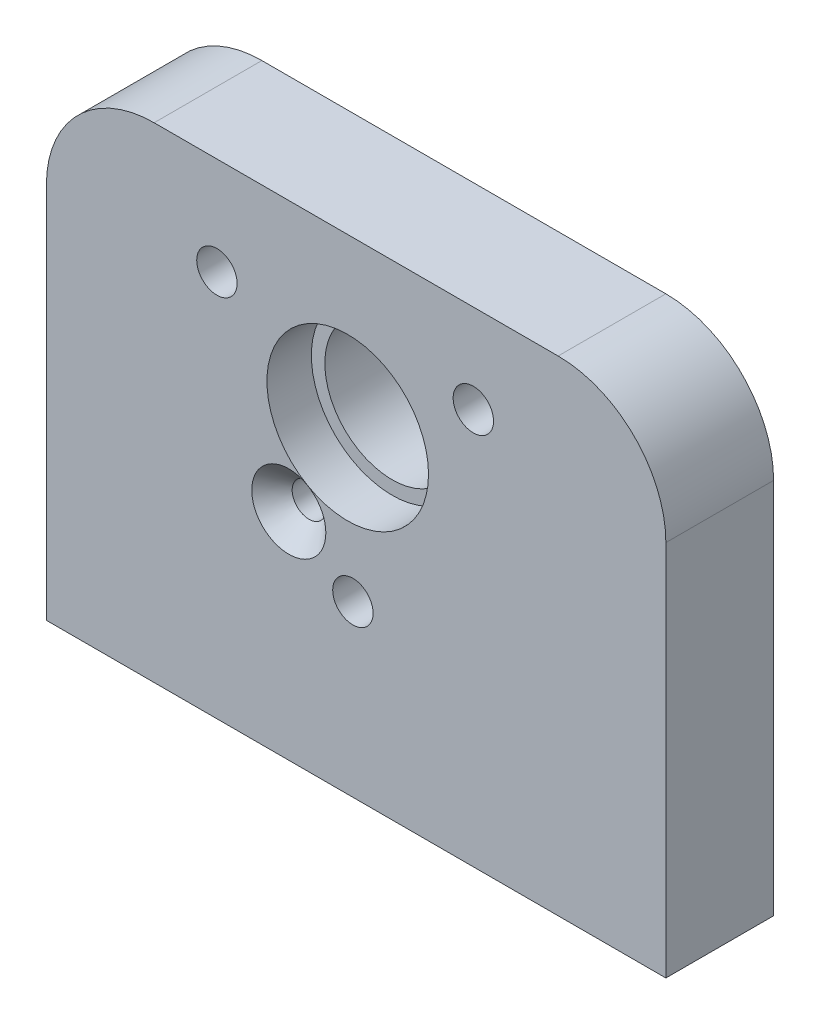
ISO-10303-21;
HEADER;
FILE_DESCRIPTION(('STEP AP214'),'2;1');
FILE_NAME('part.step','',(''),(''),'','','');
FILE_SCHEMA(('AUTOMOTIVE_DESIGN { 1 0 10303 214 1 1 1 1 }'));
ENDSEC;
DATA;
#1=APPLICATION_CONTEXT('core data for automotive mechanical design processes');
#2=APPLICATION_PROTOCOL_DEFINITION('international standard','automotive_design',2000,#1);
#3=PRODUCT_CONTEXT('',#1,'mechanical');
#4=PRODUCT('Part','Part','',(#3));
#5=PRODUCT_RELATED_PRODUCT_CATEGORY('part','',(#4));
#6=PRODUCT_DEFINITION_FORMATION('','',#4);
#7=PRODUCT_DEFINITION_CONTEXT('part definition',#1,'design');
#8=PRODUCT_DEFINITION('design','',#6,#7);
#9=PRODUCT_DEFINITION_SHAPE('','',#8);
#10=(LENGTH_UNIT() NAMED_UNIT(*) SI_UNIT(.MILLI.,.METRE.));
#11=(NAMED_UNIT(*) PLANE_ANGLE_UNIT() SI_UNIT($,.RADIAN.));
#12=(NAMED_UNIT(*) SI_UNIT($,.STERADIAN.) SOLID_ANGLE_UNIT());
#13=UNCERTAINTY_MEASURE_WITH_UNIT(LENGTH_MEASURE(1.E-05),#10,'distance_accuracy_value','');
#14=(GEOMETRIC_REPRESENTATION_CONTEXT(3) GLOBAL_UNCERTAINTY_ASSIGNED_CONTEXT((#13)) GLOBAL_UNIT_ASSIGNED_CONTEXT((#10,
#11,#12)) REPRESENTATION_CONTEXT('',''));
#15=CARTESIAN_POINT('',(0.,0.,0.));
#16=DIRECTION('',(0.,0.,1.));
#17=DIRECTION('',(1.,0.,0.));
#18=AXIS2_PLACEMENT_3D('',#15,#16,#17);
#19=CARTESIAN_POINT('',(-10.3374235216212,10.7419094738506,-3.5));
#20=DIRECTION('',(0.,0.,-1.));
#21=DIRECTION('',(-1.,0.,0.));
#22=AXIS2_PLACEMENT_3D('',#19,#20,#21);
#23=CYLINDRICAL_SURFACE('',#22,1.49999999999999);
#24=CARTESIAN_POINT('',(-10.3374235216212,10.7419094738506,4.5));
#25=DIRECTION('',(0.,0.,-1.));
#26=DIRECTION('',(-1.,0.,0.));
#27=AXIS2_PLACEMENT_3D('',#24,#25,#26);
#28=CIRCLE('',#27,1.5);
#29=CARTESIAN_POINT('',(-11.8374235216212,10.7419094738506,4.5));
#30=VERTEX_POINT('',#29);
#31=EDGE_CURVE('E247',#30,#30,#28,.T.);
#32=ORIENTED_EDGE('',*,*,#31,.F.);
#33=EDGE_LOOP('',(#32));
#34=FACE_BOUND('',#33,.T.);
#35=CARTESIAN_POINT('',(-10.3374235216212,10.7419094738506,0.5));
#36=DIRECTION('',(0.,0.,-1.));
#37=DIRECTION('',(-1.,0.,0.));
#38=AXIS2_PLACEMENT_3D('',#35,#36,#37);
#39=CIRCLE('',#38,1.49999999999999);
#40=CARTESIAN_POINT('',(-11.8374235216212,10.7419094738506,0.5));
#41=VERTEX_POINT('',#40);
#42=EDGE_CURVE('E41',#41,#41,#39,.F.);
#43=ORIENTED_EDGE('',*,*,#42,.F.);
#44=EDGE_LOOP('',(#43));
#45=FACE_BOUND('',#44,.T.);
#46=ADVANCED_FACE('F37',(#34,#45),#23,.F.);
#47=CARTESIAN_POINT('',(0.,0.,-3.5));
#48=DIRECTION('',(0.,0.,1.));
#49=DIRECTION('',(1.,0.,0.));
#50=AXIS2_PLACEMENT_3D('',#47,#48,#49);
#51=PLANE('',#50);
#52=DIRECTION('',(0.5,0.866025403784439,0.));
#53=VECTOR('',#52,1.);
#54=CARTESIAN_POINT('',(-14.3788754059486,10.7419094738506,-3.5));
#55=LINE('',#54,#53);
#56=CARTESIAN_POINT('',(-14.3788754059486,10.7419094738506,-3.5));
#57=VERTEX_POINT('',#56);
#58=CARTESIAN_POINT('',(-12.3581494637849,14.2419094738506,-3.5));
#59=VERTEX_POINT('',#58);
#60=EDGE_CURVE('E222',#57,#59,#55,.T.);
#61=ORIENTED_EDGE('',*,*,#60,.F.);
#62=DIRECTION('',(-0.5,0.866025403784438,0.));
#63=VECTOR('',#62,1.);
#64=CARTESIAN_POINT('',(-12.3581494637849,7.24190947385061,-3.5));
#65=LINE('',#64,#63);
#66=CARTESIAN_POINT('',(-12.3581494637849,7.24190947385061,-3.5));
#67=VERTEX_POINT('',#66);
#68=EDGE_CURVE('E53',#67,#57,#65,.T.);
#69=ORIENTED_EDGE('',*,*,#68,.F.);
#70=DIRECTION('',(-1.,0.,0.));
#71=VECTOR('',#70,1.);
#72=CARTESIAN_POINT('',(-8.31669757945749,7.24190947385061,-3.5));
#73=LINE('',#72,#71);
#74=CARTESIAN_POINT('',(-8.31669757945749,7.24190947385061,-3.5));
#75=VERTEX_POINT('',#74);
#76=EDGE_CURVE('E208',#75,#67,#73,.T.);
#77=ORIENTED_EDGE('',*,*,#76,.F.);
#78=DIRECTION('',(-0.5,-0.866025403784439,0.));
#79=VECTOR('',#78,1.);
#80=CARTESIAN_POINT('',(-6.2959716372938,10.7419094738506,-3.5));
#81=LINE('',#80,#79);
#82=CARTESIAN_POINT('',(-6.2959716372938,10.7419094738506,-3.5));
#83=VERTEX_POINT('',#82);
#84=EDGE_CURVE('E211',#83,#75,#81,.T.);
#85=ORIENTED_EDGE('',*,*,#84,.F.);
#86=DIRECTION('',(0.5,-0.866025403784439,0.));
#87=VECTOR('',#86,1.);
#88=CARTESIAN_POINT('',(-8.31669757945749,14.2419094738506,-3.5));
#89=LINE('',#88,#87);
#90=CARTESIAN_POINT('',(-8.31669757945749,14.2419094738506,-3.5));
#91=VERTEX_POINT('',#90);
#92=EDGE_CURVE('E227',#91,#83,#89,.T.);
#93=ORIENTED_EDGE('',*,*,#92,.F.);
#94=DIRECTION('',(1.,0.,0.));
#95=VECTOR('',#94,1.);
#96=CARTESIAN_POINT('',(-12.3581494637849,14.2419094738506,-3.5));
#97=LINE('',#96,#95);
#98=EDGE_CURVE('E224',#59,#91,#97,.T.);
#99=ORIENTED_EDGE('',*,*,#98,.F.);
#100=EDGE_LOOP('',(#61,#69,#77,#85,#93,#99));
#101=FACE_BOUND('',#100,.T.);
#102=CARTESIAN_POINT('',(8.70352905788683,11.4068341897829,-3.5));
#103=DIRECTION('',(0.,0.,-1.));
#104=DIRECTION('',(-1.,0.,0.));
#105=AXIS2_PLACEMENT_3D('',#102,#103,#104);
#106=CIRCLE('',#105,1.49999999999999);
#107=CARTESIAN_POINT('',(7.20352905788685,11.4068341897829,-3.5));
#108=VERTEX_POINT('',#107);
#109=EDGE_CURVE('E241',#108,#108,#106,.T.);
#110=ORIENTED_EDGE('',*,*,#109,.F.);
#111=EDGE_LOOP('',(#110));
#112=FACE_BOUND('',#111,.T.);
#113=CARTESIAN_POINT('',(-0.625000000000001,5.57772228311384,-3.5));
#114=DIRECTION('',(0.,0.,1.));
#115=DIRECTION('',(1.,0.,0.));
#116=AXIS2_PLACEMENT_3D('',#113,#114,#115);
#117=CIRCLE('',#116,5.00000000000001);
#118=CARTESIAN_POINT('',(4.37500000000001,5.57772228311384,-3.5));
#119=VERTEX_POINT('',#118);
#120=EDGE_CURVE('E264',#119,#119,#117,.T.);
#121=ORIENTED_EDGE('',*,*,#120,.T.);
#122=EDGE_LOOP('',(#121));
#123=FACE_BOUND('',#122,.T.);
#124=DIRECTION('',(1.,0.,0.));
#125=VECTOR('',#124,1.);
#126=CARTESIAN_POINT('',(-2.5,0.499999999999998,-3.5));
#127=LINE('',#126,#125);
#128=CARTESIAN_POINT('',(-6.5,0.499999999999998,-3.5));
#129=VERTEX_POINT('',#128);
#130=CARTESIAN_POINT('',(-3.5,0.499999999999998,-3.5));
#131=VERTEX_POINT('',#130);
#132=EDGE_CURVE('E291',#129,#131,#127,.T.);
#133=ORIENTED_EDGE('',*,*,#132,.F.);
#134=CARTESIAN_POINT('',(-6.5,-0.500000000000002,-3.5));
#135=DIRECTION('',(0.,0.,1.));
#136=DIRECTION('',(1.,0.,0.));
#137=AXIS2_PLACEMENT_3D('',#134,#135,#136);
#138=CIRCLE('',#137,1.);
#139=CARTESIAN_POINT('',(-7.5,-0.500000000000001,-3.5));
#140=VERTEX_POINT('',#139);
#141=EDGE_CURVE('E46',#129,#140,#138,.T.);
#142=ORIENTED_EDGE('',*,*,#141,.T.);
#143=DIRECTION('',(0.,1.,0.));
#144=VECTOR('',#143,1.);
#145=CARTESIAN_POINT('',(-7.5,-4.5,-3.5));
#146=LINE('',#145,#144);
#147=CARTESIAN_POINT('',(-7.5,-3.5,-3.5));
#148=VERTEX_POINT('',#147);
#149=EDGE_CURVE('E288',#148,#140,#146,.T.);
#150=ORIENTED_EDGE('',*,*,#149,.F.);
#151=CARTESIAN_POINT('',(-6.5,-3.5,-3.5));
#152=DIRECTION('',(0.,0.,1.));
#153=DIRECTION('',(1.,0.,0.));
#154=AXIS2_PLACEMENT_3D('',#151,#152,#153);
#155=CIRCLE('',#154,1.);
#156=CARTESIAN_POINT('',(-6.5,-4.5,-3.5));
#157=VERTEX_POINT('',#156);
#158=EDGE_CURVE('E392',#148,#157,#155,.T.);
#159=ORIENTED_EDGE('',*,*,#158,.T.);
#160=DIRECTION('',(-1.,0.,0.));
#161=VECTOR('',#160,1.);
#162=CARTESIAN_POINT('',(-2.5,-4.5,-3.5));
#163=LINE('',#162,#161);
#164=CARTESIAN_POINT('',(-3.5,-4.5,-3.5));
#165=VERTEX_POINT('',#164);
#166=EDGE_CURVE('E278',#165,#157,#163,.T.);
#167=ORIENTED_EDGE('',*,*,#166,.F.);
#168=CARTESIAN_POINT('',(-3.5,-3.5,-3.5));
#169=DIRECTION('',(0.,0.,1.));
#170=DIRECTION('',(1.,0.,0.));
#171=AXIS2_PLACEMENT_3D('',#168,#169,#170);
#172=CIRCLE('',#171,1.);
#173=CARTESIAN_POINT('',(-2.5,-3.5,-3.5));
#174=VERTEX_POINT('',#173);
#175=EDGE_CURVE('E390',#165,#174,#172,.T.);
#176=ORIENTED_EDGE('',*,*,#175,.T.);
#177=DIRECTION('',(0.,-1.,0.));
#178=VECTOR('',#177,1.);
#179=CARTESIAN_POINT('',(-2.5,-4.5,-3.5));
#180=LINE('',#179,#178);
#181=CARTESIAN_POINT('',(-2.5,-0.500000000000002,-3.5));
#182=VERTEX_POINT('',#181);
#183=EDGE_CURVE('E293',#182,#174,#180,.T.);
#184=ORIENTED_EDGE('',*,*,#183,.F.);
#185=CARTESIAN_POINT('',(-3.5,-0.500000000000002,-3.5));
#186=DIRECTION('',(0.,0.,1.));
#187=DIRECTION('',(1.,0.,0.));
#188=AXIS2_PLACEMENT_3D('',#185,#186,#187);
#189=CIRCLE('',#188,1.);
#190=EDGE_CURVE('E11',#182,#131,#189,.T.);
#191=ORIENTED_EDGE('',*,*,#190,.T.);
#192=EDGE_LOOP('',(#133,#142,#150,#159,#167,#176,#184,#191));
#193=FACE_BOUND('',#192,.T.);
#194=DIRECTION('',(-1.,0.,0.));
#195=VECTOR('',#194,1.);
#196=CARTESIAN_POINT('',(23.,18.,-3.5));
#197=LINE('',#196,#195);
#198=CARTESIAN_POINT('',(15.,18.,-3.5));
#199=VERTEX_POINT('',#198);
#200=CARTESIAN_POINT('',(-15.,18.,-3.5));
#201=VERTEX_POINT('',#200);
#202=EDGE_CURVE('E323',#199,#201,#197,.T.);
#203=ORIENTED_EDGE('',*,*,#202,.F.);
#204=CARTESIAN_POINT('',(15.,10.,-3.5));
#205=DIRECTION('',(0.,0.,1.));
#206=DIRECTION('',(1.,0.,0.));
#207=AXIS2_PLACEMENT_3D('',#204,#205,#206);
#208=CIRCLE('',#207,8.);
#209=CARTESIAN_POINT('',(23.,10.,-3.5));
#210=VERTEX_POINT('',#209);
#211=EDGE_CURVE('E356',#199,#210,#208,.F.);
#212=ORIENTED_EDGE('',*,*,#211,.T.);
#213=DIRECTION('',(0.,1.,0.));
#214=VECTOR('',#213,1.);
#215=CARTESIAN_POINT('',(23.,-18.,-3.5));
#216=LINE('',#215,#214);
#217=CARTESIAN_POINT('',(23.,-18.,-3.5));
#218=VERTEX_POINT('',#217);
#219=EDGE_CURVE('E319',#218,#210,#216,.T.);
#220=ORIENTED_EDGE('',*,*,#219,.F.);
#221=DIRECTION('',(1.,0.,0.));
#222=VECTOR('',#221,1.);
#223=CARTESIAN_POINT('',(-23.,-18.,-3.5));
#224=LINE('',#223,#222);
#225=CARTESIAN_POINT('',(-23.,-18.,-3.5));
#226=VERTEX_POINT('',#225);
#227=EDGE_CURVE('E316',#226,#218,#224,.T.);
#228=ORIENTED_EDGE('',*,*,#227,.F.);
#229=DIRECTION('',(0.,-1.,0.));
#230=VECTOR('',#229,1.);
#231=CARTESIAN_POINT('',(-23.,18.,-3.5));
#232=LINE('',#231,#230);
#233=CARTESIAN_POINT('',(-23.,10.,-3.5));
#234=VERTEX_POINT('',#233);
#235=EDGE_CURVE('E326',#234,#226,#232,.T.);
#236=ORIENTED_EDGE('',*,*,#235,.F.);
#237=CARTESIAN_POINT('',(-15.,10.,-3.5));
#238=DIRECTION('',(0.,0.,1.));
#239=DIRECTION('',(1.,0.,0.));
#240=AXIS2_PLACEMENT_3D('',#237,#238,#239);
#241=CIRCLE('',#240,8.);
#242=EDGE_CURVE('E354',#234,#201,#241,.F.);
#243=ORIENTED_EDGE('',*,*,#242,.T.);
#244=EDGE_LOOP('',(#203,#212,#220,#228,#236,#243));
#245=FACE_BOUND('',#244,.T.);
#246=CARTESIAN_POINT('',(-0.241105536265653,-5.41557681429202,-3.5));
#247=DIRECTION('',(0.,0.,-1.));
#248=DIRECTION('',(-1.,0.,0.));
#249=AXIS2_PLACEMENT_3D('',#246,#247,#248);
#250=CIRCLE('',#249,1.49999999999999);
#251=CARTESIAN_POINT('',(-1.74110553626564,-5.41557681429202,-3.5));
#252=VERTEX_POINT('',#251);
#253=EDGE_CURVE('E250',#252,#252,#250,.T.);
#254=ORIENTED_EDGE('',*,*,#253,.F.);
#255=EDGE_LOOP('',(#254));
#256=FACE_BOUND('',#255,.T.);
#257=ADVANCED_FACE('F395',(#101,#112,#123,#193,#245,#256),#51,.F.);
#258=CARTESIAN_POINT('',(-23.,-18.,-3.5));
#259=DIRECTION('',(0.,-1.,0.));
#260=DIRECTION('',(0.,0.,-1.));
#261=AXIS2_PLACEMENT_3D('',#258,#259,#260);
#262=PLANE('',#261);
#263=CARTESIAN_POINT('',(-19.,-18.,0.5));
#264=DIRECTION('',(0.,-1.,0.));
#265=DIRECTION('',(0.,0.,-1.));
#266=AXIS2_PLACEMENT_3D('',#263,#264,#265);
#267=CIRCLE('',#266,2.);
#268=CARTESIAN_POINT('',(-19.,-18.,-1.5));
#269=VERTEX_POINT('',#268);
#270=EDGE_CURVE('E287',#269,#269,#267,.T.);
#271=ORIENTED_EDGE('',*,*,#270,.F.);
#272=EDGE_LOOP('',(#271));
#273=FACE_BOUND('',#272,.T.);
#274=CARTESIAN_POINT('',(19.,-18.,0.5));
#275=DIRECTION('',(0.,-1.,0.));
#276=DIRECTION('',(0.,0.,-1.));
#277=AXIS2_PLACEMENT_3D('',#274,#275,#276);
#278=CIRCLE('',#277,2.);
#279=CARTESIAN_POINT('',(19.,-18.,-1.5));
#280=VERTEX_POINT('',#279);
#281=EDGE_CURVE('E303',#280,#280,#278,.T.);
#282=ORIENTED_EDGE('',*,*,#281,.F.);
#283=EDGE_LOOP('',(#282));
#284=FACE_BOUND('',#283,.T.);
#285=CARTESIAN_POINT('',(0.,-18.,0.5));
#286=DIRECTION('',(0.,-1.,0.));
#287=DIRECTION('',(0.,0.,-1.));
#288=AXIS2_PLACEMENT_3D('',#285,#286,#287);
#289=CIRCLE('',#288,1.5);
#290=CARTESIAN_POINT('',(0.,-18.,-0.999999999999998));
#291=VERTEX_POINT('',#290);
#292=EDGE_CURVE('E309',#291,#291,#289,.T.);
#293=ORIENTED_EDGE('',*,*,#292,.F.);
#294=EDGE_LOOP('',(#293));
#295=FACE_BOUND('',#294,.T.);
#296=DIRECTION('',(1.,0.,0.));
#297=VECTOR('',#296,1.);
#298=CARTESIAN_POINT('',(-23.,-18.,4.5));
#299=LINE('',#298,#297);
#300=CARTESIAN_POINT('',(-23.,-18.,4.5));
#301=VERTEX_POINT('',#300);
#302=CARTESIAN_POINT('',(23.,-18.,4.5));
#303=VERTEX_POINT('',#302);
#304=EDGE_CURVE('E315',#301,#303,#299,.T.);
#305=ORIENTED_EDGE('',*,*,#304,.F.);
#306=DIRECTION('',(0.,0.,1.));
#307=VECTOR('',#306,1.);
#308=CARTESIAN_POINT('',(-23.,-18.,-3.5));
#309=LINE('',#308,#307);
#310=EDGE_CURVE('E338',#226,#301,#309,.T.);
#311=ORIENTED_EDGE('',*,*,#310,.F.);
#312=ORIENTED_EDGE('',*,*,#227,.T.);
#313=DIRECTION('',(0.,0.,1.));
#314=VECTOR('',#313,1.);
#315=CARTESIAN_POINT('',(23.,-18.,-3.5));
#316=LINE('',#315,#314);
#317=EDGE_CURVE('E328',#218,#303,#316,.T.);
#318=ORIENTED_EDGE('',*,*,#317,.T.);
#319=EDGE_LOOP('',(#305,#311,#312,#318));
#320=FACE_BOUND('',#319,.T.);
#321=ADVANCED_FACE('F445',(#273,#284,#295,#320),#262,.T.);
#322=CARTESIAN_POINT('',(-23.,18.,-3.5));
#323=DIRECTION('',(-1.,0.,0.));
#324=DIRECTION('',(0.,0.,1.));
#325=AXIS2_PLACEMENT_3D('',#322,#323,#324);
#326=PLANE('',#325);
#327=DIRECTION('',(0.,-1.,0.));
#328=VECTOR('',#327,1.);
#329=CARTESIAN_POINT('',(-23.,18.,4.5));
#330=LINE('',#329,#328);
#331=CARTESIAN_POINT('',(-23.,10.,4.5));
#332=VERTEX_POINT('',#331);
#333=EDGE_CURVE('E320',#332,#301,#330,.T.);
#334=ORIENTED_EDGE('',*,*,#333,.F.);
#335=DIRECTION('',(0.,0.,1.));
#336=VECTOR('',#335,1.);
#337=CARTESIAN_POINT('',(-23.,10.,-3.5));
#338=LINE('',#337,#336);
#339=EDGE_CURVE('E358',#332,#234,#338,.F.);
#340=ORIENTED_EDGE('',*,*,#339,.T.);
#341=ORIENTED_EDGE('',*,*,#235,.T.);
#342=ORIENTED_EDGE('',*,*,#310,.T.);
#343=EDGE_LOOP('',(#334,#340,#341,#342));
#344=FACE_BOUND('',#343,.T.);
#345=ADVANCED_FACE('F519',(#344),#326,.T.);
#346=CARTESIAN_POINT('',(23.,18.,-3.5));
#347=DIRECTION('',(0.,1.,0.));
#348=DIRECTION('',(0.,0.,1.));
#349=AXIS2_PLACEMENT_3D('',#346,#347,#348);
#350=PLANE('',#349);
#351=DIRECTION('',(-1.,0.,0.));
#352=VECTOR('',#351,1.);
#353=CARTESIAN_POINT('',(23.,18.,4.5));
#354=LINE('',#353,#352);
#355=CARTESIAN_POINT('',(15.,18.,4.5));
#356=VERTEX_POINT('',#355);
#357=CARTESIAN_POINT('',(-15.,18.,4.5));
#358=VERTEX_POINT('',#357);
#359=EDGE_CURVE('E334',#356,#358,#354,.T.);
#360=ORIENTED_EDGE('',*,*,#359,.F.);
#361=DIRECTION('',(0.,0.,1.));
#362=VECTOR('',#361,1.);
#363=CARTESIAN_POINT('',(15.,18.,-3.5));
#364=LINE('',#363,#362);
#365=EDGE_CURVE('E352',#356,#199,#364,.F.);
#366=ORIENTED_EDGE('',*,*,#365,.T.);
#367=ORIENTED_EDGE('',*,*,#202,.T.);
#368=DIRECTION('',(0.,0.,1.));
#369=VECTOR('',#368,1.);
#370=CARTESIAN_POINT('',(-15.,18.,-3.5));
#371=LINE('',#370,#369);
#372=EDGE_CURVE('E349',#201,#358,#371,.T.);
#373=ORIENTED_EDGE('',*,*,#372,.T.);
#374=EDGE_LOOP('',(#360,#366,#367,#373));
#375=FACE_BOUND('',#374,.T.);
#376=ADVANCED_FACE('F522',(#375),#350,.T.);
#377=CARTESIAN_POINT('',(23.,-18.,-3.5));
#378=DIRECTION('',(1.,0.,0.));
#379=DIRECTION('',(0.,0.,-1.));
#380=AXIS2_PLACEMENT_3D('',#377,#378,#379);
#381=PLANE('',#380);
#382=ORIENTED_EDGE('',*,*,#219,.T.);
#383=DIRECTION('',(0.,0.,1.));
#384=VECTOR('',#383,1.);
#385=CARTESIAN_POINT('',(23.,10.,-3.5));
#386=LINE('',#385,#384);
#387=CARTESIAN_POINT('',(23.,10.,4.5));
#388=VERTEX_POINT('',#387);
#389=EDGE_CURVE('E341',#210,#388,#386,.T.);
#390=ORIENTED_EDGE('',*,*,#389,.T.);
#391=DIRECTION('',(0.,1.,0.));
#392=VECTOR('',#391,1.);
#393=CARTESIAN_POINT('',(23.,-18.,4.5));
#394=LINE('',#393,#392);
#395=EDGE_CURVE('E331',#303,#388,#394,.T.);
#396=ORIENTED_EDGE('',*,*,#395,.F.);
#397=ORIENTED_EDGE('',*,*,#317,.F.);
#398=EDGE_LOOP('',(#382,#390,#396,#397));
#399=FACE_BOUND('',#398,.T.);
#400=ADVANCED_FACE('F517',(#399),#381,.T.);
#401=CARTESIAN_POINT('',(0.,0.,4.5));
#402=DIRECTION('',(0.,0.,1.));
#403=DIRECTION('',(1.,0.,0.));
#404=AXIS2_PLACEMENT_3D('',#401,#402,#403);
#405=PLANE('',#404);
#406=CARTESIAN_POINT('',(8.70352905788683,11.4068341897829,4.5));
#407=DIRECTION('',(0.,0.,-1.));
#408=DIRECTION('',(-1.,0.,0.));
#409=AXIS2_PLACEMENT_3D('',#406,#407,#408);
#410=CIRCLE('',#409,1.5);
#411=CARTESIAN_POINT('',(7.20352905788684,11.4068341897829,4.5));
#412=VERTEX_POINT('',#411);
#413=EDGE_CURVE('E244',#412,#412,#410,.T.);
#414=ORIENTED_EDGE('',*,*,#413,.T.);
#415=EDGE_LOOP('',(#414));
#416=FACE_BOUND('',#415,.T.);
#417=ORIENTED_EDGE('',*,*,#31,.T.);
#418=EDGE_LOOP('',(#417));
#419=FACE_BOUND('',#418,.T.);
#420=CARTESIAN_POINT('',(-0.241105536265653,-5.41557681429202,4.5));
#421=DIRECTION('',(0.,0.,-1.));
#422=DIRECTION('',(-1.,0.,0.));
#423=AXIS2_PLACEMENT_3D('',#420,#421,#422);
#424=CIRCLE('',#423,1.5);
#425=CARTESIAN_POINT('',(-1.74110553626565,-5.41557681429202,4.5));
#426=VERTEX_POINT('',#425);
#427=EDGE_CURVE('E253',#426,#426,#424,.T.);
#428=ORIENTED_EDGE('',*,*,#427,.T.);
#429=EDGE_LOOP('',(#428));
#430=FACE_BOUND('',#429,.T.);
#431=CARTESIAN_POINT('',(-5.,-2.,4.5));
#432=DIRECTION('',(0.,0.,1.));
#433=DIRECTION('',(1.,0.,0.));
#434=AXIS2_PLACEMENT_3D('',#431,#432,#433);
#435=CIRCLE('',#434,2.75);
#436=CARTESIAN_POINT('',(-3.625,0.381569860407204,4.5));
#437=VERTEX_POINT('',#436);
#438=EDGE_CURVE('E267',#437,#437,#435,.T.);
#439=ORIENTED_EDGE('',*,*,#438,.F.);
#440=CARTESIAN_POINT('',(-0.625000000000001,5.57772228311384,4.5));
#441=DIRECTION('',(0.,0.,1.));
#442=DIRECTION('',(1.,0.,0.));
#443=AXIS2_PLACEMENT_3D('',#440,#441,#442);
#444=CIRCLE('',#443,6.00000000000001);
#445=EDGE_CURVE('E256',#437,#437,#444,.T.);
#446=ORIENTED_EDGE('',*,*,#445,.F.);
#447=EDGE_LOOP('',(#439,#446));
#448=FACE_BOUND('',#447,.T.);
#449=ORIENTED_EDGE('',*,*,#395,.T.);
#450=CARTESIAN_POINT('',(15.,10.,4.5));
#451=DIRECTION('',(0.,0.,1.));
#452=DIRECTION('',(1.,0.,0.));
#453=AXIS2_PLACEMENT_3D('',#450,#451,#452);
#454=CIRCLE('',#453,8.);
#455=EDGE_CURVE('E347',#388,#356,#454,.T.);
#456=ORIENTED_EDGE('',*,*,#455,.T.);
#457=ORIENTED_EDGE('',*,*,#359,.T.);
#458=CARTESIAN_POINT('',(-15.,10.,4.5));
#459=DIRECTION('',(0.,0.,1.));
#460=DIRECTION('',(1.,0.,0.));
#461=AXIS2_PLACEMENT_3D('',#458,#459,#460);
#462=CIRCLE('',#461,8.);
#463=EDGE_CURVE('E345',#358,#332,#462,.T.);
#464=ORIENTED_EDGE('',*,*,#463,.T.);
#465=ORIENTED_EDGE('',*,*,#333,.T.);
#466=ORIENTED_EDGE('',*,*,#304,.T.);
#467=EDGE_LOOP('',(#449,#456,#457,#464,#465,#466));
#468=FACE_BOUND('',#467,.T.);
#469=ADVANCED_FACE('F512',(#416,#419,#430,#448,#468),#405,.T.);
#470=CARTESIAN_POINT('',(0.,-9.5,0.5));
#471=DIRECTION('',(0.,-1.,0.));
#472=DIRECTION('',(0.,0.,-1.));
#473=AXIS2_PLACEMENT_3D('',#470,#471,#472);
#474=CONICAL_SURFACE('',#473,1.5,1.02974425867665);
#475=CARTESIAN_POINT('',(0.,-8.59870907145866,0.5));
#476=VERTEX_POINT('',#475);
#477=VERTEX_LOOP('',#476);
#478=FACE_BOUND('',#477,.T.);
#479=CARTESIAN_POINT('',(0.,-9.5,0.5));
#480=DIRECTION('',(0.,-1.,0.));
#481=DIRECTION('',(0.,0.,-1.));
#482=AXIS2_PLACEMENT_3D('',#479,#480,#481);
#483=CIRCLE('',#482,1.5);
#484=CARTESIAN_POINT('',(0.,-9.5,-0.999999999999997));
#485=VERTEX_POINT('',#484);
#486=EDGE_CURVE('E312',#485,#485,#483,.T.);
#487=ORIENTED_EDGE('',*,*,#486,.T.);
#488=EDGE_LOOP('',(#487));
#489=FACE_BOUND('',#488,.T.);
#490=ADVANCED_FACE('F509',(#478,#489),#474,.F.);
#491=CARTESIAN_POINT('',(0.,-18.,0.5));
#492=DIRECTION('',(0.,-1.,0.));
#493=DIRECTION('',(0.,0.,-1.));
#494=AXIS2_PLACEMENT_3D('',#491,#492,#493);
#495=CYLINDRICAL_SURFACE('',#494,1.5);
#496=ORIENTED_EDGE('',*,*,#486,.F.);
#497=EDGE_LOOP('',(#496));
#498=FACE_BOUND('',#497,.T.);
#499=ORIENTED_EDGE('',*,*,#292,.T.);
#500=EDGE_LOOP('',(#499));
#501=FACE_BOUND('',#500,.T.);
#502=ADVANCED_FACE('F505',(#498,#501),#495,.F.);
#503=CARTESIAN_POINT('',(19.,-10.5,0.5));
#504=DIRECTION('',(0.,-1.,0.));
#505=DIRECTION('',(0.,0.,-1.));
#506=AXIS2_PLACEMENT_3D('',#503,#504,#505);
#507=CONICAL_SURFACE('',#506,2.,1.02974425867665);
#508=CARTESIAN_POINT('',(19.,-9.29827876194488,0.5));
#509=VERTEX_POINT('',#508);
#510=VERTEX_LOOP('',#509);
#511=FACE_BOUND('',#510,.T.);
#512=CARTESIAN_POINT('',(19.,-10.5,0.5));
#513=DIRECTION('',(0.,-1.,0.));
#514=DIRECTION('',(0.,0.,-1.));
#515=AXIS2_PLACEMENT_3D('',#512,#513,#514);
#516=CIRCLE('',#515,2.);
#517=CARTESIAN_POINT('',(19.,-10.5,-1.5));
#518=VERTEX_POINT('',#517);
#519=EDGE_CURVE('E306',#518,#518,#516,.T.);
#520=ORIENTED_EDGE('',*,*,#519,.T.);
#521=EDGE_LOOP('',(#520));
#522=FACE_BOUND('',#521,.T.);
#523=ADVANCED_FACE('F501',(#511,#522),#507,.F.);
#524=CARTESIAN_POINT('',(19.,-18.,0.5));
#525=DIRECTION('',(0.,-1.,0.));
#526=DIRECTION('',(0.,0.,-1.));
#527=AXIS2_PLACEMENT_3D('',#524,#525,#526);
#528=CYLINDRICAL_SURFACE('',#527,2.);
#529=ORIENTED_EDGE('',*,*,#519,.F.);
#530=EDGE_LOOP('',(#529));
#531=FACE_BOUND('',#530,.T.);
#532=ORIENTED_EDGE('',*,*,#281,.T.);
#533=EDGE_LOOP('',(#532));
#534=FACE_BOUND('',#533,.T.);
#535=ADVANCED_FACE('F497',(#531,#534),#528,.F.);
#536=CARTESIAN_POINT('',(-19.,-10.5,0.5));
#537=DIRECTION('',(0.,-1.,0.));
#538=DIRECTION('',(0.,0.,-1.));
#539=AXIS2_PLACEMENT_3D('',#536,#537,#538);
#540=CONICAL_SURFACE('',#539,2.,1.02974425867665);
#541=CARTESIAN_POINT('',(-19.,-9.29827876194488,0.5));
#542=VERTEX_POINT('',#541);
#543=VERTEX_LOOP('',#542);
#544=FACE_BOUND('',#543,.T.);
#545=CARTESIAN_POINT('',(-19.,-10.5,0.5));
#546=DIRECTION('',(0.,-1.,0.));
#547=DIRECTION('',(0.,0.,-1.));
#548=AXIS2_PLACEMENT_3D('',#545,#546,#547);
#549=CIRCLE('',#548,2.);
#550=CARTESIAN_POINT('',(-19.,-10.5,-1.5));
#551=VERTEX_POINT('',#550);
#552=EDGE_CURVE('E300',#551,#551,#549,.T.);
#553=ORIENTED_EDGE('',*,*,#552,.T.);
#554=EDGE_LOOP('',(#553));
#555=FACE_BOUND('',#554,.T.);
#556=ADVANCED_FACE('F493',(#544,#555),#540,.F.);
#557=CARTESIAN_POINT('',(-19.,-18.,0.5));
#558=DIRECTION('',(0.,-1.,0.));
#559=DIRECTION('',(0.,0.,-1.));
#560=AXIS2_PLACEMENT_3D('',#557,#558,#559);
#561=CYLINDRICAL_SURFACE('',#560,2.);
#562=ORIENTED_EDGE('',*,*,#552,.F.);
#563=EDGE_LOOP('',(#562));
#564=FACE_BOUND('',#563,.T.);
#565=ORIENTED_EDGE('',*,*,#270,.T.);
#566=EDGE_LOOP('',(#565));
#567=FACE_BOUND('',#566,.T.);
#568=ADVANCED_FACE('F489',(#564,#567),#561,.F.);
#569=CARTESIAN_POINT('',(15.,10.,-3.5));
#570=DIRECTION('',(0.,0.,1.));
#571=DIRECTION('',(1.,0.,0.));
#572=AXIS2_PLACEMENT_3D('',#569,#570,#571);
#573=CYLINDRICAL_SURFACE('',#572,8.);
#574=ORIENTED_EDGE('',*,*,#211,.F.);
#575=ORIENTED_EDGE('',*,*,#365,.F.);
#576=ORIENTED_EDGE('',*,*,#455,.F.);
#577=ORIENTED_EDGE('',*,*,#389,.F.);
#578=EDGE_LOOP('',(#574,#575,#576,#577));
#579=FACE_BOUND('',#578,.T.);
#580=ADVANCED_FACE('F492',(#579),#573,.T.);
#581=CARTESIAN_POINT('',(-15.,10.,-3.5));
#582=DIRECTION('',(0.,0.,1.));
#583=DIRECTION('',(1.,0.,0.));
#584=AXIS2_PLACEMENT_3D('',#581,#582,#583);
#585=CYLINDRICAL_SURFACE('',#584,8.);
#586=ORIENTED_EDGE('',*,*,#242,.F.);
#587=ORIENTED_EDGE('',*,*,#339,.F.);
#588=ORIENTED_EDGE('',*,*,#463,.F.);
#589=ORIENTED_EDGE('',*,*,#372,.F.);
#590=EDGE_LOOP('',(#586,#587,#588,#589));
#591=FACE_BOUND('',#590,.T.);
#592=ADVANCED_FACE('F488',(#591),#585,.T.);
#593=CARTESIAN_POINT('',(-7.5,-4.5,1.));
#594=DIRECTION('',(-1.,0.,0.));
#595=DIRECTION('',(0.,-1.,0.));
#596=AXIS2_PLACEMENT_3D('',#593,#594,#595);
#597=PLANE('',#596);
#598=DIRECTION('',(0.,1.,0.));
#599=VECTOR('',#598,1.);
#600=CARTESIAN_POINT('',(-7.5,-4.5,1.));
#601=LINE('',#600,#599);
#602=CARTESIAN_POINT('',(-7.5,-3.5,1.));
#603=VERTEX_POINT('',#602);
#604=CARTESIAN_POINT('',(-7.5,-0.500000000000001,1.));
#605=VERTEX_POINT('',#604);
#606=EDGE_CURVE('E274',#603,#605,#601,.T.);
#607=ORIENTED_EDGE('',*,*,#606,.F.);
#608=DIRECTION('',(0.,0.,-1.));
#609=VECTOR('',#608,1.);
#610=CARTESIAN_POINT('',(-7.5,-3.5,-3.5));
#611=LINE('',#610,#609);
#612=EDGE_CURVE('E382',#603,#148,#611,.T.);
#613=ORIENTED_EDGE('',*,*,#612,.T.);
#614=ORIENTED_EDGE('',*,*,#149,.T.);
#615=DIRECTION('',(0.,0.,-1.));
#616=VECTOR('',#615,1.);
#617=CARTESIAN_POINT('',(-7.5,-0.500000000000002,1.));
#618=LINE('',#617,#616);
#619=EDGE_CURVE('E380',#140,#605,#618,.F.);
#620=ORIENTED_EDGE('',*,*,#619,.T.);
#621=EDGE_LOOP('',(#607,#613,#614,#620));
#622=FACE_BOUND('',#621,.T.);
#623=ADVANCED_FACE('F402',(#622),#597,.F.);
#624=CARTESIAN_POINT('',(-2.5,-4.5,1.));
#625=DIRECTION('',(0.,-1.,0.));
#626=DIRECTION('',(0.,0.,-1.));
#627=AXIS2_PLACEMENT_3D('',#624,#625,#626);
#628=PLANE('',#627);
#629=DIRECTION('',(-1.,0.,0.));
#630=VECTOR('',#629,1.);
#631=CARTESIAN_POINT('',(-2.5,-4.5,1.));
#632=LINE('',#631,#630);
#633=CARTESIAN_POINT('',(-3.5,-4.5,1.));
#634=VERTEX_POINT('',#633);
#635=CARTESIAN_POINT('',(-6.5,-4.5,1.));
#636=VERTEX_POINT('',#635);
#637=EDGE_CURVE('E284',#634,#636,#632,.T.);
#638=ORIENTED_EDGE('',*,*,#637,.F.);
#639=DIRECTION('',(0.,0.,-1.));
#640=VECTOR('',#639,1.);
#641=CARTESIAN_POINT('',(-3.5,-4.5,-3.5));
#642=LINE('',#641,#640);
#643=EDGE_CURVE('E364',#634,#165,#642,.T.);
#644=ORIENTED_EDGE('',*,*,#643,.T.);
#645=ORIENTED_EDGE('',*,*,#166,.T.);
#646=DIRECTION('',(0.,0.,-1.));
#647=VECTOR('',#646,1.);
#648=CARTESIAN_POINT('',(-6.5,-4.5,1.));
#649=LINE('',#648,#647);
#650=EDGE_CURVE('E360',#157,#636,#649,.F.);
#651=ORIENTED_EDGE('',*,*,#650,.T.);
#652=EDGE_LOOP('',(#638,#644,#645,#651));
#653=FACE_BOUND('',#652,.T.);
#654=ADVANCED_FACE('F426',(#653),#628,.F.);
#655=CARTESIAN_POINT('',(-2.5,-4.5,1.));
#656=DIRECTION('',(1.,0.,0.));
#657=DIRECTION('',(0.,0.,-1.));
#658=AXIS2_PLACEMENT_3D('',#655,#656,#657);
#659=PLANE('',#658);
#660=ORIENTED_EDGE('',*,*,#183,.T.);
#661=DIRECTION('',(0.,0.,-1.));
#662=VECTOR('',#661,1.);
#663=CARTESIAN_POINT('',(-2.5,-3.5,1.));
#664=LINE('',#663,#662);
#665=CARTESIAN_POINT('',(-2.5,-3.5,1.));
#666=VERTEX_POINT('',#665);
#667=EDGE_CURVE('E370',#174,#666,#664,.F.);
#668=ORIENTED_EDGE('',*,*,#667,.T.);
#669=DIRECTION('',(0.,-1.,0.));
#670=VECTOR('',#669,1.);
#671=CARTESIAN_POINT('',(-2.5,-4.5,1.));
#672=LINE('',#671,#670);
#673=CARTESIAN_POINT('',(-2.5,-0.500000000000002,1.));
#674=VERTEX_POINT('',#673);
#675=EDGE_CURVE('E281',#674,#666,#672,.T.);
#676=ORIENTED_EDGE('',*,*,#675,.F.);
#677=DIRECTION('',(0.,0.,-1.));
#678=VECTOR('',#677,1.);
#679=CARTESIAN_POINT('',(-2.5,-0.500000000000002,-3.5));
#680=LINE('',#679,#678);
#681=EDGE_CURVE('E367',#674,#182,#680,.T.);
#682=ORIENTED_EDGE('',*,*,#681,.T.);
#683=EDGE_LOOP('',(#660,#668,#676,#682));
#684=FACE_BOUND('',#683,.T.);
#685=ADVANCED_FACE('F418',(#684),#659,.F.);
#686=CARTESIAN_POINT('',(-2.5,0.499999999999998,1.));
#687=DIRECTION('',(0.,1.,0.));
#688=DIRECTION('',(0.,0.,1.));
#689=AXIS2_PLACEMENT_3D('',#686,#687,#688);
#690=PLANE('',#689);
#691=DIRECTION('',(1.,0.,0.));
#692=VECTOR('',#691,1.);
#693=CARTESIAN_POINT('',(-2.5,0.499999999999998,1.));
#694=LINE('',#693,#692);
#695=CARTESIAN_POINT('',(-6.5,0.499999999999998,1.));
#696=VERTEX_POINT('',#695);
#697=CARTESIAN_POINT('',(-3.5,0.499999999999998,1.));
#698=VERTEX_POINT('',#697);
#699=EDGE_CURVE('E277',#696,#698,#694,.T.);
#700=ORIENTED_EDGE('',*,*,#699,.F.);
#701=DIRECTION('',(0.,0.,-1.));
#702=VECTOR('',#701,1.);
#703=CARTESIAN_POINT('',(-6.5,0.499999999999998,-3.5));
#704=LINE('',#703,#702);
#705=EDGE_CURVE('E387',#696,#129,#704,.T.);
#706=ORIENTED_EDGE('',*,*,#705,.T.);
#707=ORIENTED_EDGE('',*,*,#132,.T.);
#708=DIRECTION('',(0.,0.,-1.));
#709=VECTOR('',#708,1.);
#710=CARTESIAN_POINT('',(-3.5,0.499999999999998,1.));
#711=LINE('',#710,#709);
#712=EDGE_CURVE('E385',#131,#698,#711,.F.);
#713=ORIENTED_EDGE('',*,*,#712,.T.);
#714=EDGE_LOOP('',(#700,#706,#707,#713));
#715=FACE_BOUND('',#714,.T.);
#716=ADVANCED_FACE('F411',(#715),#690,.F.);
#717=CARTESIAN_POINT('',(0.,0.,1.));
#718=DIRECTION('',(0.,0.,1.));
#719=DIRECTION('',(1.,0.,0.));
#720=AXIS2_PLACEMENT_3D('',#717,#718,#719);
#721=PLANE('',#720);
#722=CARTESIAN_POINT('',(-5.,-2.,1.));
#723=DIRECTION('',(0.,0.,1.));
#724=DIRECTION('',(1.,0.,0.));
#725=AXIS2_PLACEMENT_3D('',#722,#723,#724);
#726=CIRCLE('',#725,1.25);
#727=CARTESIAN_POINT('',(-3.75,-2.,1.));
#728=VERTEX_POINT('',#727);
#729=EDGE_CURVE('E273',#728,#728,#726,.T.);
#730=ORIENTED_EDGE('',*,*,#729,.T.);
#731=EDGE_LOOP('',(#730));
#732=FACE_BOUND('',#731,.T.);
#733=ORIENTED_EDGE('',*,*,#675,.T.);
#734=CARTESIAN_POINT('',(-3.5,-3.5,1.));
#735=DIRECTION('',(0.,0.,1.));
#736=DIRECTION('',(1.,0.,0.));
#737=AXIS2_PLACEMENT_3D('',#734,#735,#736);
#738=CIRCLE('',#737,1.);
#739=EDGE_CURVE('E378',#666,#634,#738,.F.);
#740=ORIENTED_EDGE('',*,*,#739,.T.);
#741=ORIENTED_EDGE('',*,*,#637,.T.);
#742=CARTESIAN_POINT('',(-6.5,-3.5,1.));
#743=DIRECTION('',(0.,0.,1.));
#744=DIRECTION('',(1.,0.,0.));
#745=AXIS2_PLACEMENT_3D('',#742,#743,#744);
#746=CIRCLE('',#745,1.);
#747=EDGE_CURVE('E376',#636,#603,#746,.F.);
#748=ORIENTED_EDGE('',*,*,#747,.T.);
#749=ORIENTED_EDGE('',*,*,#606,.T.);
#750=CARTESIAN_POINT('',(-6.5,-0.500000000000002,1.));
#751=DIRECTION('',(0.,0.,1.));
#752=DIRECTION('',(1.,0.,0.));
#753=AXIS2_PLACEMENT_3D('',#750,#751,#752);
#754=CIRCLE('',#753,1.);
#755=EDGE_CURVE('E374',#605,#696,#754,.F.);
#756=ORIENTED_EDGE('',*,*,#755,.T.);
#757=ORIENTED_EDGE('',*,*,#699,.T.);
#758=CARTESIAN_POINT('',(-3.5,-0.500000000000002,1.));
#759=DIRECTION('',(0.,0.,1.));
#760=DIRECTION('',(1.,0.,0.));
#761=AXIS2_PLACEMENT_3D('',#758,#759,#760);
#762=CIRCLE('',#761,1.);
#763=EDGE_CURVE('E372',#698,#674,#762,.F.);
#764=ORIENTED_EDGE('',*,*,#763,.T.);
#765=EDGE_LOOP('',(#733,#740,#741,#748,#749,#756,#757,#764));
#766=FACE_BOUND('',#765,.T.);
#767=ADVANCED_FACE('F408',(#732,#766),#721,.F.);
#768=CARTESIAN_POINT('',(-5.,-2.,4.5));
#769=DIRECTION('',(0.,0.,1.));
#770=DIRECTION('',(1.,0.,0.));
#771=AXIS2_PLACEMENT_3D('',#768,#769,#770);
#772=CYLINDRICAL_SURFACE('',#771,1.25);
#773=CARTESIAN_POINT('',(-5.,-2.,3.));
#774=DIRECTION('',(0.,0.,1.));
#775=DIRECTION('',(1.,0.,0.));
#776=AXIS2_PLACEMENT_3D('',#773,#774,#775);
#777=CIRCLE('',#776,1.25);
#778=CARTESIAN_POINT('',(-3.75,-2.,3.));
#779=VERTEX_POINT('',#778);
#780=EDGE_CURVE('E270',#779,#779,#777,.T.);
#781=ORIENTED_EDGE('',*,*,#780,.T.);
#782=EDGE_LOOP('',(#781));
#783=FACE_BOUND('',#782,.T.);
#784=ORIENTED_EDGE('',*,*,#729,.F.);
#785=EDGE_LOOP('',(#784));
#786=FACE_BOUND('',#785,.T.);
#787=ADVANCED_FACE('F472',(#783,#786),#772,.F.);
#788=CARTESIAN_POINT('',(-5.,-2.,4.5));
#789=DIRECTION('',(0.,0.,1.));
#790=DIRECTION('',(1.,0.,0.));
#791=AXIS2_PLACEMENT_3D('',#788,#789,#790);
#792=CONICAL_SURFACE('',#791,2.75,0.785398163397449);
#793=ORIENTED_EDGE('',*,*,#780,.F.);
#794=EDGE_LOOP('',(#793));
#795=FACE_BOUND('',#794,.T.);
#796=ORIENTED_EDGE('',*,*,#438,.T.);
#797=EDGE_LOOP('',(#796));
#798=FACE_BOUND('',#797,.T.);
#799=ADVANCED_FACE('F468',(#795,#798),#792,.F.);
#800=CARTESIAN_POINT('',(-0.625000000000001,5.57772228311384,4.5));
#801=DIRECTION('',(0.,0.,1.));
#802=DIRECTION('',(1.,0.,0.));
#803=AXIS2_PLACEMENT_3D('',#800,#801,#802);
#804=CYLINDRICAL_SURFACE('',#803,5.00000000000001);
#805=ORIENTED_EDGE('',*,*,#120,.F.);
#806=EDGE_LOOP('',(#805));
#807=FACE_BOUND('',#806,.T.);
#808=CARTESIAN_POINT('',(-0.625000000000001,5.57772228311384,1.2));
#809=DIRECTION('',(0.,0.,1.));
#810=DIRECTION('',(1.,0.,0.));
#811=AXIS2_PLACEMENT_3D('',#808,#809,#810);
#812=CIRCLE('',#811,5.00000000000001);
#813=CARTESIAN_POINT('',(4.37500000000001,5.57772228311384,1.2));
#814=VERTEX_POINT('',#813);
#815=EDGE_CURVE('E261',#814,#814,#812,.T.);
#816=ORIENTED_EDGE('',*,*,#815,.T.);
#817=EDGE_LOOP('',(#816));
#818=FACE_BOUND('',#817,.T.);
#819=ADVANCED_FACE('F464',(#807,#818),#804,.F.);
#820=CARTESIAN_POINT('',(4.37500000000001,5.57772228311384,1.2));
#821=DIRECTION('',(0.,0.,-1.));
#822=DIRECTION('',(-1.,0.,0.));
#823=AXIS2_PLACEMENT_3D('',#820,#821,#822);
#824=PLANE('',#823);
#825=ORIENTED_EDGE('',*,*,#815,.F.);
#826=EDGE_LOOP('',(#825));
#827=FACE_BOUND('',#826,.T.);
#828=CARTESIAN_POINT('',(-0.625000000000001,5.57772228311384,1.2));
#829=DIRECTION('',(0.,0.,1.));
#830=DIRECTION('',(1.,0.,0.));
#831=AXIS2_PLACEMENT_3D('',#828,#829,#830);
#832=CIRCLE('',#831,6.00000000000001);
#833=CARTESIAN_POINT('',(5.37500000000001,5.57772228311384,1.2));
#834=VERTEX_POINT('',#833);
#835=EDGE_CURVE('E258',#834,#834,#832,.T.);
#836=ORIENTED_EDGE('',*,*,#835,.T.);
#837=EDGE_LOOP('',(#836));
#838=FACE_BOUND('',#837,.T.);
#839=ADVANCED_FACE('F460',(#827,#838),#824,.F.);
#840=CARTESIAN_POINT('',(-0.625000000000001,5.57772228311384,4.5));
#841=DIRECTION('',(0.,0.,1.));
#842=DIRECTION('',(1.,0.,0.));
#843=AXIS2_PLACEMENT_3D('',#840,#841,#842);
#844=CYLINDRICAL_SURFACE('',#843,6.00000000000001);
#845=ORIENTED_EDGE('',*,*,#835,.F.);
#846=EDGE_LOOP('',(#845));
#847=FACE_BOUND('',#846,.T.);
#848=ORIENTED_EDGE('',*,*,#445,.T.);
#849=EDGE_LOOP('',(#848));
#850=FACE_BOUND('',#849,.T.);
#851=ADVANCED_FACE('F456',(#847,#850),#844,.F.);
#852=CARTESIAN_POINT('',(-0.241105536265653,-5.41557681429202,-3.5));
#853=DIRECTION('',(0.,0.,-1.));
#854=DIRECTION('',(-1.,0.,0.));
#855=AXIS2_PLACEMENT_3D('',#852,#853,#854);
#856=CYLINDRICAL_SURFACE('',#855,1.49999999999999);
#857=ORIENTED_EDGE('',*,*,#427,.F.);
#858=EDGE_LOOP('',(#857));
#859=FACE_BOUND('',#858,.T.);
#860=ORIENTED_EDGE('',*,*,#253,.T.);
#861=EDGE_LOOP('',(#860));
#862=FACE_BOUND('',#861,.T.);
#863=ADVANCED_FACE('F453',(#859,#862),#856,.F.);
#864=CARTESIAN_POINT('',(8.70352905788683,11.4068341897829,-3.5));
#865=DIRECTION('',(0.,0.,-1.));
#866=DIRECTION('',(-1.,0.,0.));
#867=AXIS2_PLACEMENT_3D('',#864,#865,#866);
#868=CYLINDRICAL_SURFACE('',#867,1.49999999999999);
#869=ORIENTED_EDGE('',*,*,#413,.F.);
#870=EDGE_LOOP('',(#869));
#871=FACE_BOUND('',#870,.T.);
#872=ORIENTED_EDGE('',*,*,#109,.T.);
#873=EDGE_LOOP('',(#872));
#874=FACE_BOUND('',#873,.T.);
#875=ADVANCED_FACE('F437',(#871,#874),#868,.F.);
#876=CARTESIAN_POINT('',(-3.5,-3.5,1.));
#877=DIRECTION('',(0.,0.,1.));
#878=DIRECTION('',(1.,0.,0.));
#879=AXIS2_PLACEMENT_3D('',#876,#877,#878);
#880=CYLINDRICAL_SURFACE('',#879,1.);
#881=ORIENTED_EDGE('',*,*,#739,.F.);
#882=ORIENTED_EDGE('',*,*,#667,.F.);
#883=ORIENTED_EDGE('',*,*,#175,.F.);
#884=ORIENTED_EDGE('',*,*,#643,.F.);
#885=EDGE_LOOP('',(#881,#882,#883,#884));
#886=FACE_BOUND('',#885,.T.);
#887=ADVANCED_FACE('F421',(#886),#880,.F.);
#888=CARTESIAN_POINT('',(-6.5,-3.5,1.));
#889=DIRECTION('',(0.,0.,1.));
#890=DIRECTION('',(1.,0.,0.));
#891=AXIS2_PLACEMENT_3D('',#888,#889,#890);
#892=CYLINDRICAL_SURFACE('',#891,1.);
#893=ORIENTED_EDGE('',*,*,#747,.F.);
#894=ORIENTED_EDGE('',*,*,#650,.F.);
#895=ORIENTED_EDGE('',*,*,#158,.F.);
#896=ORIENTED_EDGE('',*,*,#612,.F.);
#897=EDGE_LOOP('',(#893,#894,#895,#896));
#898=FACE_BOUND('',#897,.T.);
#899=ADVANCED_FACE('F430',(#898),#892,.F.);
#900=CARTESIAN_POINT('',(-6.5,-0.500000000000002,1.));
#901=DIRECTION('',(0.,0.,1.));
#902=DIRECTION('',(1.,0.,0.));
#903=AXIS2_PLACEMENT_3D('',#900,#901,#902);
#904=CYLINDRICAL_SURFACE('',#903,1.);
#905=ORIENTED_EDGE('',*,*,#755,.F.);
#906=ORIENTED_EDGE('',*,*,#619,.F.);
#907=ORIENTED_EDGE('',*,*,#141,.F.);
#908=ORIENTED_EDGE('',*,*,#705,.F.);
#909=EDGE_LOOP('',(#905,#906,#907,#908));
#910=FACE_BOUND('',#909,.T.);
#911=ADVANCED_FACE('F405',(#910),#904,.F.);
#912=CARTESIAN_POINT('',(-3.5,-0.500000000000002,1.));
#913=DIRECTION('',(0.,0.,1.));
#914=DIRECTION('',(1.,0.,0.));
#915=AXIS2_PLACEMENT_3D('',#912,#913,#914);
#916=CYLINDRICAL_SURFACE('',#915,1.);
#917=ORIENTED_EDGE('',*,*,#763,.F.);
#918=ORIENTED_EDGE('',*,*,#712,.F.);
#919=ORIENTED_EDGE('',*,*,#190,.F.);
#920=ORIENTED_EDGE('',*,*,#681,.F.);
#921=EDGE_LOOP('',(#917,#918,#919,#920));
#922=FACE_BOUND('',#921,.T.);
#923=ADVANCED_FACE('F39',(#922),#916,.F.);
#924=CARTESIAN_POINT('',(0.,0.,0.5));
#925=DIRECTION('',(0.,0.,-1.));
#926=DIRECTION('',(-1.,0.,0.));
#927=AXIS2_PLACEMENT_3D('',#924,#925,#926);
#928=PLANE('',#927);
#929=DIRECTION('',(-0.5,0.866025403784438,0.));
#930=VECTOR('',#929,1.);
#931=CARTESIAN_POINT('',(-12.3581494637849,7.24190947385061,0.5));
#932=LINE('',#931,#930);
#933=CARTESIAN_POINT('',(-12.3581494637849,7.24190947385061,0.5));
#934=VERTEX_POINT('',#933);
#935=CARTESIAN_POINT('',(-14.3788754059486,10.7419094738506,0.5));
#936=VERTEX_POINT('',#935);
#937=EDGE_CURVE('E188',#934,#936,#932,.T.);
#938=ORIENTED_EDGE('',*,*,#937,.T.);
#939=DIRECTION('',(0.5,0.866025403784439,0.));
#940=VECTOR('',#939,1.);
#941=CARTESIAN_POINT('',(-14.3788754059486,10.7419094738506,0.5));
#942=LINE('',#941,#940);
#943=CARTESIAN_POINT('',(-12.3581494637849,14.2419094738506,0.5));
#944=VERTEX_POINT('',#943);
#945=EDGE_CURVE('E197',#936,#944,#942,.T.);
#946=ORIENTED_EDGE('',*,*,#945,.T.);
#947=DIRECTION('',(1.,0.,0.));
#948=VECTOR('',#947,1.);
#949=CARTESIAN_POINT('',(-12.3581494637849,14.2419094738506,0.5));
#950=LINE('',#949,#948);
#951=CARTESIAN_POINT('',(-8.31669757945749,14.2419094738506,0.5));
#952=VERTEX_POINT('',#951);
#953=EDGE_CURVE('E202',#944,#952,#950,.T.);
#954=ORIENTED_EDGE('',*,*,#953,.T.);
#955=DIRECTION('',(0.5,-0.866025403784439,0.));
#956=VECTOR('',#955,1.);
#957=CARTESIAN_POINT('',(-8.31669757945749,14.2419094738506,0.5));
#958=LINE('',#957,#956);
#959=CARTESIAN_POINT('',(-6.2959716372938,10.7419094738506,0.5));
#960=VERTEX_POINT('',#959);
#961=EDGE_CURVE('E215',#952,#960,#958,.T.);
#962=ORIENTED_EDGE('',*,*,#961,.T.);
#963=DIRECTION('',(-0.5,-0.866025403784439,0.));
#964=VECTOR('',#963,1.);
#965=CARTESIAN_POINT('',(-6.2959716372938,10.7419094738506,0.5));
#966=LINE('',#965,#964);
#967=CARTESIAN_POINT('',(-8.31669757945749,7.24190947385061,0.5));
#968=VERTEX_POINT('',#967);
#969=EDGE_CURVE('E218',#960,#968,#966,.T.);
#970=ORIENTED_EDGE('',*,*,#969,.T.);
#971=DIRECTION('',(-1.,0.,0.));
#972=VECTOR('',#971,1.);
#973=CARTESIAN_POINT('',(-8.31669757945749,7.24190947385061,0.5));
#974=LINE('',#973,#972);
#975=EDGE_CURVE('E194',#968,#934,#974,.T.);
#976=ORIENTED_EDGE('',*,*,#975,.T.);
#977=EDGE_LOOP('',(#938,#946,#954,#962,#970,#976));
#978=FACE_BOUND('',#977,.T.);
#979=ORIENTED_EDGE('',*,*,#42,.T.);
#980=EDGE_LOOP('',(#979));
#981=FACE_BOUND('',#980,.T.);
#982=ADVANCED_FACE('F204',(#978,#981),#928,.T.);
#983=CARTESIAN_POINT('',(-12.3581494637849,7.24190947385061,0.5));
#984=DIRECTION('',(-0.866025403784439,-0.5,0.));
#985=DIRECTION('',(0.5,-0.866025403784438,0.));
#986=AXIS2_PLACEMENT_3D('',#983,#984,#985);
#987=PLANE('',#986);
#988=ORIENTED_EDGE('',*,*,#68,.T.);
#989=DIRECTION('',(0.,0.,-1.));
#990=VECTOR('',#989,1.);
#991=CARTESIAN_POINT('',(-14.3788754059486,10.7419094738506,0.5));
#992=LINE('',#991,#990);
#993=EDGE_CURVE('E184',#936,#57,#992,.T.);
#994=ORIENTED_EDGE('',*,*,#993,.F.);
#995=ORIENTED_EDGE('',*,*,#937,.F.);
#996=DIRECTION('',(0.,0.,-1.));
#997=VECTOR('',#996,1.);
#998=CARTESIAN_POINT('',(-12.3581494637849,7.24190947385061,0.5));
#999=LINE('',#998,#997);
#1000=EDGE_CURVE('E232',#934,#67,#999,.T.);
#1001=ORIENTED_EDGE('',*,*,#1000,.T.);
#1002=EDGE_LOOP('',(#988,#994,#995,#1001));
#1003=FACE_BOUND('',#1002,.T.);
#1004=ADVANCED_FACE('F186',(#1003),#987,.F.);
#1005=CARTESIAN_POINT('',(-8.31669757945749,7.24190947385061,0.5));
#1006=DIRECTION('',(0.,-1.,0.));
#1007=DIRECTION('',(1.,0.,0.));
#1008=AXIS2_PLACEMENT_3D('',#1005,#1006,#1007);
#1009=PLANE('',#1008);
#1010=ORIENTED_EDGE('',*,*,#76,.T.);
#1011=ORIENTED_EDGE('',*,*,#1000,.F.);
#1012=ORIENTED_EDGE('',*,*,#975,.F.);
#1013=DIRECTION('',(0.,0.,-1.));
#1014=VECTOR('',#1013,1.);
#1015=CARTESIAN_POINT('',(-8.31669757945749,7.24190947385061,0.5));
#1016=LINE('',#1015,#1014);
#1017=EDGE_CURVE('E234',#968,#75,#1016,.T.);
#1018=ORIENTED_EDGE('',*,*,#1017,.T.);
#1019=EDGE_LOOP('',(#1010,#1011,#1012,#1018));
#1020=FACE_BOUND('',#1019,.T.);
#1021=ADVANCED_FACE('F661',(#1020),#1009,.F.);
#1022=CARTESIAN_POINT('',(-6.2959716372938,10.7419094738506,0.5));
#1023=DIRECTION('',(0.866025403784439,-0.5,0.));
#1024=DIRECTION('',(0.5,0.866025403784439,0.));
#1025=AXIS2_PLACEMENT_3D('',#1022,#1023,#1024);
#1026=PLANE('',#1025);
#1027=ORIENTED_EDGE('',*,*,#84,.T.);
#1028=ORIENTED_EDGE('',*,*,#1017,.F.);
#1029=ORIENTED_EDGE('',*,*,#969,.F.);
#1030=DIRECTION('',(0.,0.,-1.));
#1031=VECTOR('',#1030,1.);
#1032=CARTESIAN_POINT('',(-6.2959716372938,10.7419094738506,0.5));
#1033=LINE('',#1032,#1031);
#1034=EDGE_CURVE('E236',#960,#83,#1033,.T.);
#1035=ORIENTED_EDGE('',*,*,#1034,.T.);
#1036=EDGE_LOOP('',(#1027,#1028,#1029,#1035));
#1037=FACE_BOUND('',#1036,.T.);
#1038=ADVANCED_FACE('F669',(#1037),#1026,.F.);
#1039=CARTESIAN_POINT('',(-8.31669757945749,14.2419094738506,0.5));
#1040=DIRECTION('',(0.866025403784439,0.5,0.));
#1041=DIRECTION('',(-0.5,0.866025403784439,0.));
#1042=AXIS2_PLACEMENT_3D('',#1039,#1040,#1041);
#1043=PLANE('',#1042);
#1044=ORIENTED_EDGE('',*,*,#92,.T.);
#1045=ORIENTED_EDGE('',*,*,#1034,.F.);
#1046=ORIENTED_EDGE('',*,*,#961,.F.);
#1047=DIRECTION('',(0.,0.,-1.));
#1048=VECTOR('',#1047,1.);
#1049=CARTESIAN_POINT('',(-8.31669757945749,14.2419094738506,0.5));
#1050=LINE('',#1049,#1048);
#1051=EDGE_CURVE('E238',#952,#91,#1050,.T.);
#1052=ORIENTED_EDGE('',*,*,#1051,.T.);
#1053=EDGE_LOOP('',(#1044,#1045,#1046,#1052));
#1054=FACE_BOUND('',#1053,.T.);
#1055=ADVANCED_FACE('F679',(#1054),#1043,.F.);
#1056=CARTESIAN_POINT('',(-12.3581494637849,14.2419094738506,0.5));
#1057=DIRECTION('',(0.,1.,0.));
#1058=DIRECTION('',(-1.,0.,0.));
#1059=AXIS2_PLACEMENT_3D('',#1056,#1057,#1058);
#1060=PLANE('',#1059);
#1061=ORIENTED_EDGE('',*,*,#98,.T.);
#1062=ORIENTED_EDGE('',*,*,#1051,.F.);
#1063=ORIENTED_EDGE('',*,*,#953,.F.);
#1064=DIRECTION('',(0.,0.,-1.));
#1065=VECTOR('',#1064,1.);
#1066=CARTESIAN_POINT('',(-12.3581494637849,14.2419094738506,0.5));
#1067=LINE('',#1066,#1065);
#1068=EDGE_CURVE('E193',#944,#59,#1067,.T.);
#1069=ORIENTED_EDGE('',*,*,#1068,.T.);
#1070=EDGE_LOOP('',(#1061,#1062,#1063,#1069));
#1071=FACE_BOUND('',#1070,.T.);
#1072=ADVANCED_FACE('F689',(#1071),#1060,.F.);
#1073=CARTESIAN_POINT('',(-14.3788754059486,10.7419094738506,0.5));
#1074=DIRECTION('',(-0.866025403784438,0.5,0.));
#1075=DIRECTION('',(-0.5,-0.866025403784439,0.));
#1076=AXIS2_PLACEMENT_3D('',#1073,#1074,#1075);
#1077=PLANE('',#1076);
#1078=ORIENTED_EDGE('',*,*,#60,.T.);
#1079=ORIENTED_EDGE('',*,*,#1068,.F.);
#1080=ORIENTED_EDGE('',*,*,#945,.F.);
#1081=ORIENTED_EDGE('',*,*,#993,.T.);
#1082=EDGE_LOOP('',(#1078,#1079,#1080,#1081));
#1083=FACE_BOUND('',#1082,.T.);
#1084=ADVANCED_FACE('F198',(#1083),#1077,.F.);
#1085=CLOSED_SHELL('',(#46,#257,#321,#345,#376,#400,#469,#490,#502,#523,#535,#556,#568,#580,
#592,#623,#654,#685,#716,#767,#787,#799,#819,#839,#851,#863,#875,#887,#899,#911,#923,#982,#1004,
#1021,#1038,#1055,#1072,#1084));
#1086=MANIFOLD_SOLID_BREP('B2',#1085);
#1087=ADVANCED_BREP_SHAPE_REPRESENTATION('',(#18,#1086),#14);
#1088=SHAPE_DEFINITION_REPRESENTATION(#9,#1087);
ENDSEC;
END-ISO-10303-21;
